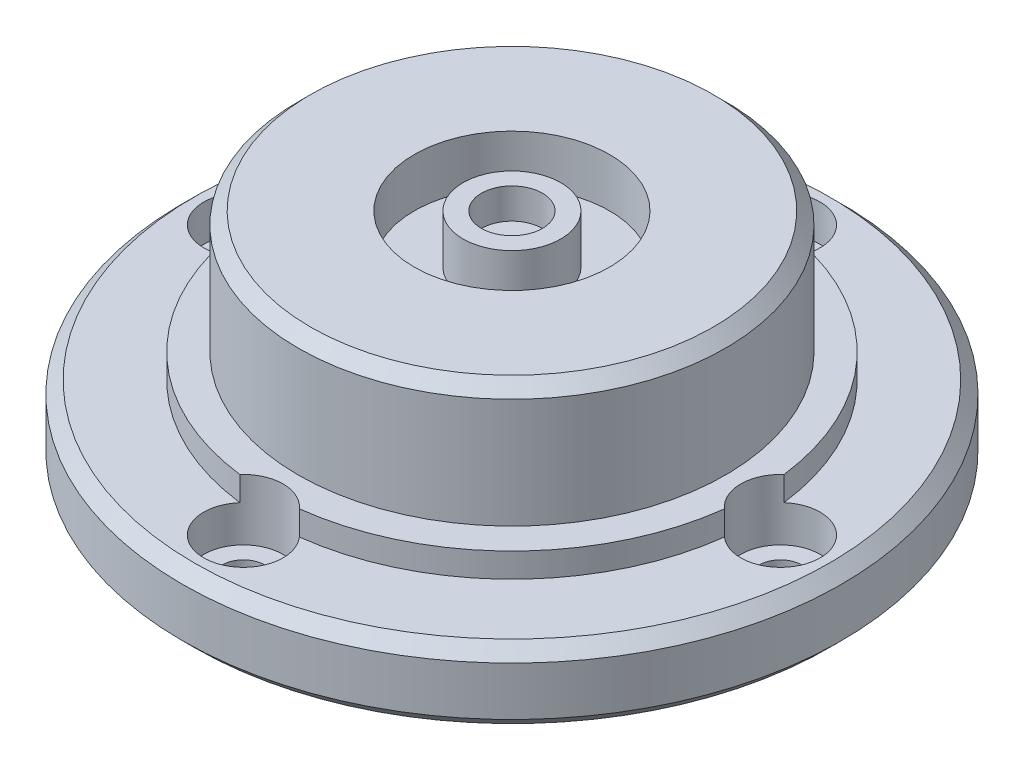
ISO-10303-21;
HEADER;
FILE_DESCRIPTION(('STEP AP214'),'2;1');
FILE_NAME('part.step','',(''),(''),'','','');
FILE_SCHEMA(('AUTOMOTIVE_DESIGN { 1 0 10303 214 1 1 1 1 }'));
ENDSEC;
DATA;
#1=APPLICATION_CONTEXT('core data for automotive mechanical design processes');
#2=APPLICATION_PROTOCOL_DEFINITION('international standard','automotive_design',2000,#1);
#3=PRODUCT_CONTEXT('',#1,'mechanical');
#4=PRODUCT('Part','Part','',(#3));
#5=PRODUCT_RELATED_PRODUCT_CATEGORY('part','',(#4));
#6=PRODUCT_DEFINITION_FORMATION('','',#4);
#7=PRODUCT_DEFINITION_CONTEXT('part definition',#1,'design');
#8=PRODUCT_DEFINITION('design','',#6,#7);
#9=PRODUCT_DEFINITION_SHAPE('','',#8);
#10=(LENGTH_UNIT() NAMED_UNIT(*) SI_UNIT(.MILLI.,.METRE.));
#11=(NAMED_UNIT(*) PLANE_ANGLE_UNIT() SI_UNIT($,.RADIAN.));
#12=(NAMED_UNIT(*) SI_UNIT($,.STERADIAN.) SOLID_ANGLE_UNIT());
#13=UNCERTAINTY_MEASURE_WITH_UNIT(LENGTH_MEASURE(1.E-05),#10,'distance_accuracy_value','');
#14=(GEOMETRIC_REPRESENTATION_CONTEXT(3) GLOBAL_UNCERTAINTY_ASSIGNED_CONTEXT((#13)) GLOBAL_UNIT_ASSIGNED_CONTEXT((#10,
#11,#12)) REPRESENTATION_CONTEXT('',''));
#15=CARTESIAN_POINT('',(0.,0.,0.));
#16=DIRECTION('',(0.,0.,1.));
#17=DIRECTION('',(1.,0.,0.));
#18=AXIS2_PLACEMENT_3D('',#15,#16,#17);
#19=CARTESIAN_POINT('',(0.,18.,0.));
#20=DIRECTION('',(0.,-1.,0.));
#21=DIRECTION('',(0.,0.,-1.));
#22=AXIS2_PLACEMENT_3D('',#19,#20,#21);
#23=CYLINDRICAL_SURFACE('',#22,20.);
#24=DIRECTION('',(0.,-1.,0.));
#25=VECTOR('',#24,1.);
#26=CARTESIAN_POINT('',(2.43796309372538,10.5,-19.8508522727271));
#27=LINE('',#26,#25);
#28=CARTESIAN_POINT('',(2.43796309372537,8.,-19.8508522727271));
#29=VERTEX_POINT('',#28);
#30=CARTESIAN_POINT('',(2.43796309372538,6.,-19.8508522727271));
#31=VERTEX_POINT('',#30);
#32=EDGE_CURVE('E234',#29,#31,#27,.T.);
#33=ORIENTED_EDGE('',*,*,#32,.F.);
#34=CARTESIAN_POINT('',(0.,8.,0.));
#35=DIRECTION('',(0.,1.,0.));
#36=DIRECTION('',(0.,0.,1.));
#37=AXIS2_PLACEMENT_3D('',#34,#35,#36);
#38=CIRCLE('',#37,20.);
#39=CARTESIAN_POINT('',(19.8508522727271,8.,-2.43796309372538));
#40=VERTEX_POINT('',#39);
#41=EDGE_CURVE('E120',#40,#29,#38,.T.);
#42=ORIENTED_EDGE('',*,*,#41,.F.);
#43=DIRECTION('',(0.,-1.,0.));
#44=VECTOR('',#43,1.);
#45=CARTESIAN_POINT('',(19.8508522727271,10.5,-2.43796309372538));
#46=LINE('',#45,#44);
#47=CARTESIAN_POINT('',(19.8508522727271,6.,-2.43796309372538));
#48=VERTEX_POINT('',#47);
#49=EDGE_CURVE('E227',#48,#40,#46,.F.);
#50=ORIENTED_EDGE('',*,*,#49,.F.);
#51=CARTESIAN_POINT('',(0.,6.,0.));
#52=DIRECTION('',(0.,1.,0.));
#53=DIRECTION('',(0.,0.,1.));
#54=AXIS2_PLACEMENT_3D('',#51,#52,#53);
#55=CIRCLE('',#54,20.);
#56=EDGE_CURVE('E252',#48,#31,#55,.T.);
#57=ORIENTED_EDGE('',*,*,#56,.T.);
#58=EDGE_LOOP('',(#33,#42,#50,#57));
#59=FACE_BOUND('',#58,.T.);
#60=ADVANCED_FACE('F33',(#59),#23,.T.);
#61=DIRECTION('',(0.,-1.,0.));
#62=VECTOR('',#61,1.);
#63=CARTESIAN_POINT('',(-2.43796309372538,10.5,-19.8508522727271));
#64=LINE('',#63,#62);
#65=CARTESIAN_POINT('',(-2.43796309372538,6.,-19.8508522727271));
#66=VERTEX_POINT('',#65);
#67=CARTESIAN_POINT('',(-2.43796309372537,8.,-19.8508522727271));
#68=VERTEX_POINT('',#67);
#69=EDGE_CURVE('E56',#66,#68,#64,.F.);
#70=ORIENTED_EDGE('',*,*,#69,.F.);
#71=CARTESIAN_POINT('',(-19.8508522727271,6.,-2.43796309372538));
#72=VERTEX_POINT('',#71);
#73=EDGE_CURVE('E114',#66,#72,#55,.T.);
#74=ORIENTED_EDGE('',*,*,#73,.T.);
#75=DIRECTION('',(0.,-1.,0.));
#76=VECTOR('',#75,1.);
#77=CARTESIAN_POINT('',(-19.8508522727271,10.5,-2.43796309372538));
#78=LINE('',#77,#76);
#79=CARTESIAN_POINT('',(-19.8508522727271,8.,-2.43796309372537));
#80=VERTEX_POINT('',#79);
#81=EDGE_CURVE('E99',#80,#72,#78,.T.);
#82=ORIENTED_EDGE('',*,*,#81,.F.);
#83=EDGE_CURVE('E112',#68,#80,#38,.T.);
#84=ORIENTED_EDGE('',*,*,#83,.F.);
#85=EDGE_LOOP('',(#70,#74,#82,#84));
#86=FACE_BOUND('',#85,.T.);
#87=ADVANCED_FACE('F111',(#86),#23,.T.);
#88=DIRECTION('',(0.,-1.,0.));
#89=VECTOR('',#88,1.);
#90=CARTESIAN_POINT('',(19.8508522727271,10.5,2.43796309372538));
#91=LINE('',#90,#89);
#92=CARTESIAN_POINT('',(19.8508522727271,8.,2.43796309372537));
#93=VERTEX_POINT('',#92);
#94=CARTESIAN_POINT('',(19.8508522727271,6.,2.43796309372538));
#95=VERTEX_POINT('',#94);
#96=EDGE_CURVE('E222',#93,#95,#91,.T.);
#97=ORIENTED_EDGE('',*,*,#96,.F.);
#98=CARTESIAN_POINT('',(2.43796309372538,8.,19.8508522727271));
#99=VERTEX_POINT('',#98);
#100=EDGE_CURVE('E123',#99,#93,#38,.T.);
#101=ORIENTED_EDGE('',*,*,#100,.F.);
#102=DIRECTION('',(0.,-1.,0.));
#103=VECTOR('',#102,1.);
#104=CARTESIAN_POINT('',(2.43796309372538,10.5,19.8508522727271));
#105=LINE('',#104,#103);
#106=CARTESIAN_POINT('',(2.43796309372538,6.,19.8508522727271));
#107=VERTEX_POINT('',#106);
#108=EDGE_CURVE('E215',#107,#99,#105,.F.);
#109=ORIENTED_EDGE('',*,*,#108,.F.);
#110=EDGE_CURVE('E223',#107,#95,#55,.T.);
#111=ORIENTED_EDGE('',*,*,#110,.T.);
#112=EDGE_LOOP('',(#97,#101,#109,#111));
#113=FACE_BOUND('',#112,.T.);
#114=ADVANCED_FACE('F193',(#113),#23,.T.);
#115=DIRECTION('',(0.,-1.,0.));
#116=VECTOR('',#115,1.);
#117=CARTESIAN_POINT('',(-2.43796309372538,10.5,19.8508522727271));
#118=LINE('',#117,#116);
#119=CARTESIAN_POINT('',(-2.43796309372537,8.,19.8508522727271));
#120=VERTEX_POINT('',#119);
#121=CARTESIAN_POINT('',(-2.43796309372538,6.,19.8508522727271));
#122=VERTEX_POINT('',#121);
#123=EDGE_CURVE('E210',#120,#122,#118,.T.);
#124=ORIENTED_EDGE('',*,*,#123,.F.);
#125=CARTESIAN_POINT('',(-19.8508522727271,8.,2.43796309372538));
#126=VERTEX_POINT('',#125);
#127=EDGE_CURVE('E121',#126,#120,#38,.T.);
#128=ORIENTED_EDGE('',*,*,#127,.F.);
#129=DIRECTION('',(0.,-1.,0.));
#130=VECTOR('',#129,1.);
#131=CARTESIAN_POINT('',(-19.8508522727271,10.5,2.43796309372538));
#132=LINE('',#131,#130);
#133=CARTESIAN_POINT('',(-19.8508522727271,6.,2.43796309372538));
#134=VERTEX_POINT('',#133);
#135=EDGE_CURVE('E48',#134,#126,#132,.F.);
#136=ORIENTED_EDGE('',*,*,#135,.F.);
#137=EDGE_CURVE('E128',#134,#122,#55,.T.);
#138=ORIENTED_EDGE('',*,*,#137,.T.);
#139=EDGE_LOOP('',(#124,#128,#136,#138));
#140=FACE_BOUND('',#139,.T.);
#141=ADVANCED_FACE('F189',(#140),#23,.T.);
#142=CARTESIAN_POINT('',(-22.,18.,0.));
#143=DIRECTION('',(0.,-1.,0.));
#144=DIRECTION('',(0.,0.,-1.));
#145=AXIS2_PLACEMENT_3D('',#142,#143,#144);
#146=CYLINDRICAL_SURFACE('',#145,1.75000000000146);
#147=CARTESIAN_POINT('',(-22.,0.,0.));
#148=DIRECTION('',(0.,1.,0.));
#149=DIRECTION('',(0.,0.,1.));
#150=AXIS2_PLACEMENT_3D('',#147,#148,#149);
#151=CIRCLE('',#150,1.75000000000146);
#152=CARTESIAN_POINT('',(-22.,0.,1.75000000000146));
#153=VERTEX_POINT('',#152);
#154=EDGE_CURVE('E239',#153,#153,#151,.T.);
#155=ORIENTED_EDGE('',*,*,#154,.F.);
#156=EDGE_LOOP('',(#155));
#157=FACE_BOUND('',#156,.T.);
#158=CARTESIAN_POINT('',(-22.,3.,0.));
#159=DIRECTION('',(0.,1.,0.));
#160=DIRECTION('',(0.,0.,1.));
#161=AXIS2_PLACEMENT_3D('',#158,#159,#160);
#162=CIRCLE('',#161,1.75000000000146);
#163=CARTESIAN_POINT('',(-22.,3.,1.75000000000146));
#164=VERTEX_POINT('',#163);
#165=EDGE_CURVE('E140',#164,#164,#162,.T.);
#166=ORIENTED_EDGE('',*,*,#165,.T.);
#167=EDGE_LOOP('',(#166));
#168=FACE_BOUND('',#167,.T.);
#169=ADVANCED_FACE('F198',(#157,#168),#146,.F.);
#170=CARTESIAN_POINT('',(0.,18.,22.));
#171=DIRECTION('',(0.,-1.,0.));
#172=DIRECTION('',(0.,0.,-1.));
#173=AXIS2_PLACEMENT_3D('',#170,#171,#172);
#174=CYLINDRICAL_SURFACE('',#173,1.75000000000146);
#175=CARTESIAN_POINT('',(0.,0.,22.));
#176=DIRECTION('',(0.,1.,0.));
#177=DIRECTION('',(0.,0.,1.));
#178=AXIS2_PLACEMENT_3D('',#175,#176,#177);
#179=CIRCLE('',#178,1.75000000000146);
#180=CARTESIAN_POINT('',(0.,0.,23.7500000000015));
#181=VERTEX_POINT('',#180);
#182=EDGE_CURVE('E246',#181,#181,#179,.T.);
#183=ORIENTED_EDGE('',*,*,#182,.F.);
#184=EDGE_LOOP('',(#183));
#185=FACE_BOUND('',#184,.T.);
#186=CARTESIAN_POINT('',(0.,3.,22.));
#187=DIRECTION('',(0.,1.,0.));
#188=DIRECTION('',(0.,0.,1.));
#189=AXIS2_PLACEMENT_3D('',#186,#187,#188);
#190=CIRCLE('',#189,1.75000000000146);
#191=CARTESIAN_POINT('',(0.,3.,23.7500000000015));
#192=VERTEX_POINT('',#191);
#193=EDGE_CURVE('E137',#192,#192,#190,.T.);
#194=ORIENTED_EDGE('',*,*,#193,.T.);
#195=EDGE_LOOP('',(#194));
#196=FACE_BOUND('',#195,.T.);
#197=ADVANCED_FACE('F204',(#185,#196),#174,.F.);
#198=CARTESIAN_POINT('',(22.,18.,0.));
#199=DIRECTION('',(0.,-1.,0.));
#200=DIRECTION('',(0.,0.,-1.));
#201=AXIS2_PLACEMENT_3D('',#198,#199,#200);
#202=CYLINDRICAL_SURFACE('',#201,1.75000000000146);
#203=CARTESIAN_POINT('',(22.,0.,0.));
#204=DIRECTION('',(0.,1.,0.));
#205=DIRECTION('',(0.,0.,1.));
#206=AXIS2_PLACEMENT_3D('',#203,#204,#205);
#207=CIRCLE('',#206,1.75000000000146);
#208=CARTESIAN_POINT('',(22.,0.,1.75000000000146));
#209=VERTEX_POINT('',#208);
#210=EDGE_CURVE('E243',#209,#209,#207,.T.);
#211=ORIENTED_EDGE('',*,*,#210,.F.);
#212=EDGE_LOOP('',(#211));
#213=FACE_BOUND('',#212,.T.);
#214=CARTESIAN_POINT('',(22.,3.,0.));
#215=DIRECTION('',(0.,1.,0.));
#216=DIRECTION('',(0.,0.,1.));
#217=AXIS2_PLACEMENT_3D('',#214,#215,#216);
#218=CIRCLE('',#217,1.75000000000146);
#219=CARTESIAN_POINT('',(22.,3.,1.75000000000146));
#220=VERTEX_POINT('',#219);
#221=EDGE_CURVE('E133',#220,#220,#218,.T.);
#222=ORIENTED_EDGE('',*,*,#221,.T.);
#223=EDGE_LOOP('',(#222));
#224=FACE_BOUND('',#223,.T.);
#225=ADVANCED_FACE('F313',(#213,#224),#202,.F.);
#226=CARTESIAN_POINT('',(0.,18.,-22.));
#227=DIRECTION('',(0.,-1.,0.));
#228=DIRECTION('',(0.,0.,-1.));
#229=AXIS2_PLACEMENT_3D('',#226,#227,#228);
#230=CYLINDRICAL_SURFACE('',#229,1.75000000000146);
#231=CARTESIAN_POINT('',(0.,0.,-22.));
#232=DIRECTION('',(0.,1.,0.));
#233=DIRECTION('',(0.,0.,1.));
#234=AXIS2_PLACEMENT_3D('',#231,#232,#233);
#235=CIRCLE('',#234,1.75000000000146);
#236=CARTESIAN_POINT('',(0.,0.,-20.2499999999985));
#237=VERTEX_POINT('',#236);
#238=EDGE_CURVE('E240',#237,#237,#235,.T.);
#239=ORIENTED_EDGE('',*,*,#238,.F.);
#240=EDGE_LOOP('',(#239));
#241=FACE_BOUND('',#240,.T.);
#242=CARTESIAN_POINT('',(0.,3.,-22.));
#243=DIRECTION('',(0.,1.,0.));
#244=DIRECTION('',(0.,0.,1.));
#245=AXIS2_PLACEMENT_3D('',#242,#243,#244);
#246=CIRCLE('',#245,1.75000000000146);
#247=CARTESIAN_POINT('',(0.,3.,-20.2499999999985));
#248=VERTEX_POINT('',#247);
#249=EDGE_CURVE('E130',#248,#248,#246,.T.);
#250=ORIENTED_EDGE('',*,*,#249,.T.);
#251=EDGE_LOOP('',(#250));
#252=FACE_BOUND('',#251,.T.);
#253=ADVANCED_FACE('F309',(#241,#252),#230,.F.);
#254=CARTESIAN_POINT('',(0.,18.,0.));
#255=DIRECTION('',(0.,-1.,0.));
#256=DIRECTION('',(0.,0.,-1.));
#257=AXIS2_PLACEMENT_3D('',#254,#255,#256);
#258=CYLINDRICAL_SURFACE('',#257,27.);
#259=CARTESIAN_POINT('',(0.,4.99999999999999,0.));
#260=DIRECTION('',(0.,1.,0.));
#261=DIRECTION('',(0.,0.,1.));
#262=AXIS2_PLACEMENT_3D('',#259,#260,#261);
#263=CIRCLE('',#262,27.);
#264=CARTESIAN_POINT('',(0.,4.99999999999999,27.));
#265=VERTEX_POINT('',#264);
#266=EDGE_CURVE('E11',#265,#265,#263,.F.);
#267=ORIENTED_EDGE('',*,*,#266,.T.);
#268=EDGE_LOOP('',(#267));
#269=FACE_BOUND('',#268,.T.);
#270=CARTESIAN_POINT('',(0.,0.999999999999997,0.));
#271=DIRECTION('',(0.,1.,0.));
#272=DIRECTION('',(0.,0.,1.));
#273=AXIS2_PLACEMENT_3D('',#270,#271,#272);
#274=CIRCLE('',#273,27.);
#275=CARTESIAN_POINT('',(0.,0.999999999999997,27.));
#276=VERTEX_POINT('',#275);
#277=EDGE_CURVE('E161',#276,#276,#274,.T.);
#278=ORIENTED_EDGE('',*,*,#277,.T.);
#279=EDGE_LOOP('',(#278));
#280=FACE_BOUND('',#279,.T.);
#281=ADVANCED_FACE('F312',(#269,#280),#258,.T.);
#282=CARTESIAN_POINT('',(0.,0.,0.));
#283=DIRECTION('',(0.,1.,0.));
#284=DIRECTION('',(0.,0.,1.));
#285=AXIS2_PLACEMENT_3D('',#282,#283,#284);
#286=PLANE('',#285);
#287=CARTESIAN_POINT('',(0.,0.,0.));
#288=DIRECTION('',(0.,1.,0.));
#289=DIRECTION('',(0.,0.,1.));
#290=AXIS2_PLACEMENT_3D('',#287,#288,#289);
#291=CIRCLE('',#290,26.);
#292=CARTESIAN_POINT('',(0.,0.,26.));
#293=VERTEX_POINT('',#292);
#294=EDGE_CURVE('E164',#293,#293,#291,.F.);
#295=ORIENTED_EDGE('',*,*,#294,.T.);
#296=EDGE_LOOP('',(#295));
#297=FACE_BOUND('',#296,.T.);
#298=CARTESIAN_POINT('',(0.,0.,0.));
#299=DIRECTION('',(0.,1.,0.));
#300=DIRECTION('',(0.,0.,1.));
#301=AXIS2_PLACEMENT_3D('',#298,#299,#300);
#302=CIRCLE('',#301,15.1);
#303=CARTESIAN_POINT('',(0.,0.,15.1));
#304=VERTEX_POINT('',#303);
#305=EDGE_CURVE('E149',#304,#304,#302,.T.);
#306=ORIENTED_EDGE('',*,*,#305,.T.);
#307=EDGE_LOOP('',(#306));
#308=FACE_BOUND('',#307,.T.);
#309=ORIENTED_EDGE('',*,*,#238,.T.);
#310=EDGE_LOOP('',(#309));
#311=FACE_BOUND('',#310,.T.);
#312=ORIENTED_EDGE('',*,*,#210,.T.);
#313=EDGE_LOOP('',(#312));
#314=FACE_BOUND('',#313,.T.);
#315=ORIENTED_EDGE('',*,*,#182,.T.);
#316=EDGE_LOOP('',(#315));
#317=FACE_BOUND('',#316,.T.);
#318=ORIENTED_EDGE('',*,*,#154,.T.);
#319=EDGE_LOOP('',(#318));
#320=FACE_BOUND('',#319,.T.);
#321=ADVANCED_FACE('F341',(#297,#308,#311,#314,#317,#320),#286,.F.);
#322=CARTESIAN_POINT('',(0.,5.,0.));
#323=DIRECTION('',(0.,-1.,0.));
#324=DIRECTION('',(0.,0.,-1.));
#325=AXIS2_PLACEMENT_3D('',#322,#323,#324);
#326=CYLINDRICAL_SURFACE('',#325,14.1);
#327=CARTESIAN_POINT('',(0.,0.999999999999994,0.));
#328=DIRECTION('',(0.,1.,0.));
#329=DIRECTION('',(0.,0.,1.));
#330=AXIS2_PLACEMENT_3D('',#327,#328,#329);
#331=CIRCLE('',#330,14.1);
#332=CARTESIAN_POINT('',(0.,0.999999999999994,14.1));
#333=VERTEX_POINT('',#332);
#334=EDGE_CURVE('E152',#333,#333,#331,.F.);
#335=ORIENTED_EDGE('',*,*,#334,.T.);
#336=EDGE_LOOP('',(#335));
#337=FACE_BOUND('',#336,.T.);
#338=CARTESIAN_POINT('',(0.,5.,0.));
#339=DIRECTION('',(0.,1.,0.));
#340=DIRECTION('',(0.,0.,1.));
#341=AXIS2_PLACEMENT_3D('',#338,#339,#340);
#342=CIRCLE('',#341,14.1);
#343=CARTESIAN_POINT('',(0.,5.,14.1));
#344=VERTEX_POINT('',#343);
#345=EDGE_CURVE('E106',#344,#344,#342,.T.);
#346=ORIENTED_EDGE('',*,*,#345,.T.);
#347=EDGE_LOOP('',(#346));
#348=FACE_BOUND('',#347,.T.);
#349=ADVANCED_FACE('F335',(#337,#348),#326,.F.);
#350=CARTESIAN_POINT('',(0.,5.,0.));
#351=DIRECTION('',(0.,1.,0.));
#352=DIRECTION('',(0.,0.,1.));
#353=AXIS2_PLACEMENT_3D('',#350,#351,#352);
#354=PLANE('',#353);
#355=ORIENTED_EDGE('',*,*,#345,.F.);
#356=EDGE_LOOP('',(#355));
#357=FACE_BOUND('',#356,.T.);
#358=ADVANCED_FACE('F329',(#357),#354,.F.);
#359=CARTESIAN_POINT('',(0.,6.,0.));
#360=DIRECTION('',(0.,1.,0.));
#361=DIRECTION('',(0.,0.,1.));
#362=AXIS2_PLACEMENT_3D('',#359,#360,#361);
#363=PLANE('',#362);
#364=CARTESIAN_POINT('',(0.,6.,0.));
#365=DIRECTION('',(0.,1.,0.));
#366=DIRECTION('',(0.,0.,1.));
#367=AXIS2_PLACEMENT_3D('',#364,#365,#366);
#368=CIRCLE('',#367,26.);
#369=CARTESIAN_POINT('',(0.,6.,26.));
#370=VERTEX_POINT('',#369);
#371=EDGE_CURVE('E41',#370,#370,#368,.T.);
#372=ORIENTED_EDGE('',*,*,#371,.T.);
#373=EDGE_LOOP('',(#372));
#374=FACE_BOUND('',#373,.T.);
#375=ORIENTED_EDGE('',*,*,#73,.F.);
#376=CARTESIAN_POINT('',(0.,6.,-22.));
#377=DIRECTION('',(0.,1.,0.));
#378=DIRECTION('',(0.,0.,1.));
#379=AXIS2_PLACEMENT_3D('',#376,#377,#378);
#380=CIRCLE('',#379,3.25000000000146);
#381=EDGE_CURVE('E236',#66,#31,#380,.F.);
#382=ORIENTED_EDGE('',*,*,#381,.T.);
#383=ORIENTED_EDGE('',*,*,#56,.F.);
#384=CARTESIAN_POINT('',(22.,6.,0.));
#385=DIRECTION('',(0.,1.,0.));
#386=DIRECTION('',(0.,0.,1.));
#387=AXIS2_PLACEMENT_3D('',#384,#385,#386);
#388=CIRCLE('',#387,3.25000000000146);
#389=EDGE_CURVE('E226',#48,#95,#388,.F.);
#390=ORIENTED_EDGE('',*,*,#389,.T.);
#391=ORIENTED_EDGE('',*,*,#110,.F.);
#392=CARTESIAN_POINT('',(0.,6.,22.));
#393=DIRECTION('',(0.,1.,0.));
#394=DIRECTION('',(0.,0.,1.));
#395=AXIS2_PLACEMENT_3D('',#392,#393,#394);
#396=CIRCLE('',#395,3.25000000000146);
#397=EDGE_CURVE('E214',#107,#122,#396,.F.);
#398=ORIENTED_EDGE('',*,*,#397,.T.);
#399=ORIENTED_EDGE('',*,*,#137,.F.);
#400=CARTESIAN_POINT('',(-22.,6.,0.));
#401=DIRECTION('',(0.,1.,0.));
#402=DIRECTION('',(0.,0.,1.));
#403=AXIS2_PLACEMENT_3D('',#400,#401,#402);
#404=CIRCLE('',#403,3.25000000000146);
#405=EDGE_CURVE('E115',#134,#72,#404,.F.);
#406=ORIENTED_EDGE('',*,*,#405,.T.);
#407=EDGE_LOOP('',(#375,#382,#383,#390,#391,#398,#399,#406));
#408=FACE_BOUND('',#407,.T.);
#409=ADVANCED_FACE('F169',(#374,#408),#363,.T.);
#410=CARTESIAN_POINT('',(0.,8.,0.));
#411=DIRECTION('',(0.,1.,0.));
#412=DIRECTION('',(0.,0.,1.));
#413=AXIS2_PLACEMENT_3D('',#410,#411,#412);
#414=PLANE('',#413);
#415=CARTESIAN_POINT('',(0.,8.,0.));
#416=DIRECTION('',(0.,1.,0.));
#417=DIRECTION('',(0.,0.,1.));
#418=AXIS2_PLACEMENT_3D('',#415,#416,#417);
#419=CIRCLE('',#418,17.5);
#420=CARTESIAN_POINT('',(0.,8.,17.5));
#421=VERTEX_POINT('',#420);
#422=EDGE_CURVE('E124',#421,#421,#419,.T.);
#423=ORIENTED_EDGE('',*,*,#422,.F.);
#424=EDGE_LOOP('',(#423));
#425=FACE_BOUND('',#424,.T.);
#426=ORIENTED_EDGE('',*,*,#41,.T.);
#427=CARTESIAN_POINT('',(0.,8.,-22.));
#428=DIRECTION('',(0.,1.,0.));
#429=DIRECTION('',(0.,0.,1.));
#430=AXIS2_PLACEMENT_3D('',#427,#428,#429);
#431=CIRCLE('',#430,3.25000000000146);
#432=EDGE_CURVE('E119',#29,#68,#431,.F.);
#433=ORIENTED_EDGE('',*,*,#432,.T.);
#434=ORIENTED_EDGE('',*,*,#83,.T.);
#435=CARTESIAN_POINT('',(-22.,8.,0.));
#436=DIRECTION('',(0.,1.,0.));
#437=DIRECTION('',(0.,0.,1.));
#438=AXIS2_PLACEMENT_3D('',#435,#436,#437);
#439=CIRCLE('',#438,3.25000000000146);
#440=EDGE_CURVE('E95',#80,#126,#439,.F.);
#441=ORIENTED_EDGE('',*,*,#440,.T.);
#442=ORIENTED_EDGE('',*,*,#127,.T.);
#443=CARTESIAN_POINT('',(0.,8.,22.));
#444=DIRECTION('',(0.,1.,0.));
#445=DIRECTION('',(0.,0.,1.));
#446=AXIS2_PLACEMENT_3D('',#443,#444,#445);
#447=CIRCLE('',#446,3.25000000000146);
#448=EDGE_CURVE('E105',#120,#99,#447,.F.);
#449=ORIENTED_EDGE('',*,*,#448,.T.);
#450=ORIENTED_EDGE('',*,*,#100,.T.);
#451=CARTESIAN_POINT('',(22.,8.,0.));
#452=DIRECTION('',(0.,1.,0.));
#453=DIRECTION('',(0.,0.,1.));
#454=AXIS2_PLACEMENT_3D('',#451,#452,#453);
#455=CIRCLE('',#454,3.25000000000146);
#456=EDGE_CURVE('E145',#93,#40,#455,.F.);
#457=ORIENTED_EDGE('',*,*,#456,.T.);
#458=EDGE_LOOP('',(#426,#433,#434,#441,#442,#449,#450,#457));
#459=FACE_BOUND('',#458,.T.);
#460=ADVANCED_FACE('F118',(#425,#459),#414,.T.);
#461=CARTESIAN_POINT('',(0.,18.,0.));
#462=DIRECTION('',(0.,-1.,0.));
#463=DIRECTION('',(0.,0.,-1.));
#464=AXIS2_PLACEMENT_3D('',#461,#462,#463);
#465=CYLINDRICAL_SURFACE('',#464,17.5);
#466=CARTESIAN_POINT('',(0.,17.,0.));
#467=DIRECTION('',(0.,1.,0.));
#468=DIRECTION('',(0.,0.,1.));
#469=AXIS2_PLACEMENT_3D('',#466,#467,#468);
#470=CIRCLE('',#469,17.5);
#471=CARTESIAN_POINT('',(0.,17.,17.5));
#472=VERTEX_POINT('',#471);
#473=EDGE_CURVE('E158',#472,#472,#470,.F.);
#474=ORIENTED_EDGE('',*,*,#473,.T.);
#475=EDGE_LOOP('',(#474));
#476=FACE_BOUND('',#475,.T.);
#477=ORIENTED_EDGE('',*,*,#422,.T.);
#478=EDGE_LOOP('',(#477));
#479=FACE_BOUND('',#478,.T.);
#480=ADVANCED_FACE('F321',(#476,#479),#465,.T.);
#481=CARTESIAN_POINT('',(0.,18.,0.));
#482=DIRECTION('',(0.,1.,0.));
#483=DIRECTION('',(0.,0.,1.));
#484=AXIS2_PLACEMENT_3D('',#481,#482,#483);
#485=PLANE('',#484);
#486=CARTESIAN_POINT('',(0.,18.,0.));
#487=DIRECTION('',(0.,1.,0.));
#488=DIRECTION('',(0.,0.,1.));
#489=AXIS2_PLACEMENT_3D('',#486,#487,#488);
#490=CIRCLE('',#489,8.);
#491=CARTESIAN_POINT('',(0.,18.,8.));
#492=VERTEX_POINT('',#491);
#493=EDGE_CURVE('E463',#492,#492,#490,.T.);
#494=ORIENTED_EDGE('',*,*,#493,.F.);
#495=EDGE_LOOP('',(#494));
#496=FACE_BOUND('',#495,.T.);
#497=CARTESIAN_POINT('',(0.,18.,0.));
#498=DIRECTION('',(0.,1.,0.));
#499=DIRECTION('',(0.,0.,1.));
#500=AXIS2_PLACEMENT_3D('',#497,#498,#499);
#501=CIRCLE('',#500,16.5);
#502=CARTESIAN_POINT('',(0.,18.,16.5));
#503=VERTEX_POINT('',#502);
#504=EDGE_CURVE('E155',#503,#503,#501,.T.);
#505=ORIENTED_EDGE('',*,*,#504,.T.);
#506=EDGE_LOOP('',(#505));
#507=FACE_BOUND('',#506,.T.);
#508=ADVANCED_FACE('F262',(#496,#507),#485,.T.);
#509=CARTESIAN_POINT('',(0.,18.,-22.));
#510=DIRECTION('',(0.,-1.,0.));
#511=DIRECTION('',(0.,0.,-1.));
#512=AXIS2_PLACEMENT_3D('',#509,#510,#511);
#513=CYLINDRICAL_SURFACE('',#512,3.25000000000146);
#514=ORIENTED_EDGE('',*,*,#69,.T.);
#515=ORIENTED_EDGE('',*,*,#432,.F.);
#516=ORIENTED_EDGE('',*,*,#32,.T.);
#517=ORIENTED_EDGE('',*,*,#381,.F.);
#518=EDGE_LOOP('',(#514,#515,#516,#517));
#519=FACE_BOUND('',#518,.T.);
#520=CARTESIAN_POINT('',(0.,3.,-22.));
#521=DIRECTION('',(0.,1.,0.));
#522=DIRECTION('',(0.,0.,1.));
#523=AXIS2_PLACEMENT_3D('',#520,#521,#522);
#524=CIRCLE('',#523,3.25000000000146);
#525=CARTESIAN_POINT('',(0.,3.,-18.7499999999985));
#526=VERTEX_POINT('',#525);
#527=EDGE_CURVE('E134',#526,#526,#524,.T.);
#528=ORIENTED_EDGE('',*,*,#527,.F.);
#529=EDGE_LOOP('',(#528));
#530=FACE_BOUND('',#529,.T.);
#531=ADVANCED_FACE('F258',(#519,#530),#513,.F.);
#532=CARTESIAN_POINT('',(0.,3.,-22.));
#533=DIRECTION('',(0.,1.,0.));
#534=DIRECTION('',(0.,0.,1.));
#535=AXIS2_PLACEMENT_3D('',#532,#533,#534);
#536=PLANE('',#535);
#537=ORIENTED_EDGE('',*,*,#249,.F.);
#538=EDGE_LOOP('',(#537));
#539=FACE_BOUND('',#538,.T.);
#540=ORIENTED_EDGE('',*,*,#527,.T.);
#541=EDGE_LOOP('',(#540));
#542=FACE_BOUND('',#541,.T.);
#543=ADVANCED_FACE('F261',(#539,#542),#536,.T.);
#544=CARTESIAN_POINT('',(22.,18.,0.));
#545=DIRECTION('',(0.,-1.,0.));
#546=DIRECTION('',(0.,0.,-1.));
#547=AXIS2_PLACEMENT_3D('',#544,#545,#546);
#548=CYLINDRICAL_SURFACE('',#547,3.25000000000146);
#549=ORIENTED_EDGE('',*,*,#49,.T.);
#550=ORIENTED_EDGE('',*,*,#456,.F.);
#551=ORIENTED_EDGE('',*,*,#96,.T.);
#552=ORIENTED_EDGE('',*,*,#389,.F.);
#553=EDGE_LOOP('',(#549,#550,#551,#552));
#554=FACE_BOUND('',#553,.T.);
#555=CARTESIAN_POINT('',(22.,3.,0.));
#556=DIRECTION('',(0.,1.,0.));
#557=DIRECTION('',(0.,0.,1.));
#558=AXIS2_PLACEMENT_3D('',#555,#556,#557);
#559=CIRCLE('',#558,3.25000000000146);
#560=CARTESIAN_POINT('',(22.,3.,3.25000000000146));
#561=VERTEX_POINT('',#560);
#562=EDGE_CURVE('E267',#561,#561,#559,.T.);
#563=ORIENTED_EDGE('',*,*,#562,.F.);
#564=EDGE_LOOP('',(#563));
#565=FACE_BOUND('',#564,.T.);
#566=ADVANCED_FACE('F302',(#554,#565),#548,.F.);
#567=CARTESIAN_POINT('',(22.,3.,0.));
#568=DIRECTION('',(0.,1.,0.));
#569=DIRECTION('',(0.,0.,1.));
#570=AXIS2_PLACEMENT_3D('',#567,#568,#569);
#571=PLANE('',#570);
#572=ORIENTED_EDGE('',*,*,#221,.F.);
#573=EDGE_LOOP('',(#572));
#574=FACE_BOUND('',#573,.T.);
#575=ORIENTED_EDGE('',*,*,#562,.T.);
#576=EDGE_LOOP('',(#575));
#577=FACE_BOUND('',#576,.T.);
#578=ADVANCED_FACE('F288',(#574,#577),#571,.T.);
#579=CARTESIAN_POINT('',(0.,18.,22.));
#580=DIRECTION('',(0.,-1.,0.));
#581=DIRECTION('',(0.,0.,-1.));
#582=AXIS2_PLACEMENT_3D('',#579,#580,#581);
#583=CYLINDRICAL_SURFACE('',#582,3.25000000000146);
#584=ORIENTED_EDGE('',*,*,#108,.T.);
#585=ORIENTED_EDGE('',*,*,#448,.F.);
#586=ORIENTED_EDGE('',*,*,#123,.T.);
#587=ORIENTED_EDGE('',*,*,#397,.F.);
#588=EDGE_LOOP('',(#584,#585,#586,#587));
#589=FACE_BOUND('',#588,.T.);
#590=CARTESIAN_POINT('',(0.,3.,22.));
#591=DIRECTION('',(0.,1.,0.));
#592=DIRECTION('',(0.,0.,1.));
#593=AXIS2_PLACEMENT_3D('',#590,#591,#592);
#594=CIRCLE('',#593,3.25000000000146);
#595=CARTESIAN_POINT('',(0.,3.,25.2500000000015));
#596=VERTEX_POINT('',#595);
#597=EDGE_CURVE('E270',#596,#596,#594,.T.);
#598=ORIENTED_EDGE('',*,*,#597,.F.);
#599=EDGE_LOOP('',(#598));
#600=FACE_BOUND('',#599,.T.);
#601=ADVANCED_FACE('F284',(#589,#600),#583,.F.);
#602=CARTESIAN_POINT('',(0.,3.,22.));
#603=DIRECTION('',(0.,1.,0.));
#604=DIRECTION('',(0.,0.,1.));
#605=AXIS2_PLACEMENT_3D('',#602,#603,#604);
#606=PLANE('',#605);
#607=ORIENTED_EDGE('',*,*,#193,.F.);
#608=EDGE_LOOP('',(#607));
#609=FACE_BOUND('',#608,.T.);
#610=ORIENTED_EDGE('',*,*,#597,.T.);
#611=EDGE_LOOP('',(#610));
#612=FACE_BOUND('',#611,.T.);
#613=ADVANCED_FACE('F287',(#609,#612),#606,.T.);
#614=CARTESIAN_POINT('',(-22.,18.,0.));
#615=DIRECTION('',(0.,-1.,0.));
#616=DIRECTION('',(0.,0.,-1.));
#617=AXIS2_PLACEMENT_3D('',#614,#615,#616);
#618=CYLINDRICAL_SURFACE('',#617,3.25000000000146);
#619=ORIENTED_EDGE('',*,*,#135,.T.);
#620=ORIENTED_EDGE('',*,*,#440,.F.);
#621=ORIENTED_EDGE('',*,*,#81,.T.);
#622=ORIENTED_EDGE('',*,*,#405,.F.);
#623=EDGE_LOOP('',(#619,#620,#621,#622));
#624=FACE_BOUND('',#623,.T.);
#625=CARTESIAN_POINT('',(-22.,3.,0.));
#626=DIRECTION('',(0.,1.,0.));
#627=DIRECTION('',(0.,0.,1.));
#628=AXIS2_PLACEMENT_3D('',#625,#626,#627);
#629=CIRCLE('',#628,3.25000000000146);
#630=CARTESIAN_POINT('',(-22.,3.,3.25000000000146));
#631=VERTEX_POINT('',#630);
#632=EDGE_CURVE('E278',#631,#631,#629,.T.);
#633=ORIENTED_EDGE('',*,*,#632,.F.);
#634=EDGE_LOOP('',(#633));
#635=FACE_BOUND('',#634,.T.);
#636=ADVANCED_FACE('F97',(#624,#635),#618,.F.);
#637=CARTESIAN_POINT('',(-22.,3.,0.));
#638=DIRECTION('',(0.,1.,0.));
#639=DIRECTION('',(0.,0.,1.));
#640=AXIS2_PLACEMENT_3D('',#637,#638,#639);
#641=PLANE('',#640);
#642=ORIENTED_EDGE('',*,*,#165,.F.);
#643=EDGE_LOOP('',(#642));
#644=FACE_BOUND('',#643,.T.);
#645=ORIENTED_EDGE('',*,*,#632,.T.);
#646=EDGE_LOOP('',(#645));
#647=FACE_BOUND('',#646,.T.);
#648=ADVANCED_FACE('F298',(#644,#647),#641,.T.);
#649=CARTESIAN_POINT('',(0.,0.,0.));
#650=DIRECTION('',(0.,-1.,0.));
#651=DIRECTION('',(0.,0.,-1.));
#652=AXIS2_PLACEMENT_3D('',#649,#650,#651);
#653=CONICAL_SURFACE('',#652,15.1,0.785398163397445);
#654=ORIENTED_EDGE('',*,*,#334,.F.);
#655=EDGE_LOOP('',(#654));
#656=FACE_BOUND('',#655,.T.);
#657=ORIENTED_EDGE('',*,*,#305,.F.);
#658=EDGE_LOOP('',(#657));
#659=FACE_BOUND('',#658,.T.);
#660=ADVANCED_FACE('F306',(#656,#659),#653,.F.);
#661=CARTESIAN_POINT('',(0.,18.,0.));
#662=DIRECTION('',(0.,-1.,0.));
#663=DIRECTION('',(0.,0.,-1.));
#664=AXIS2_PLACEMENT_3D('',#661,#662,#663);
#665=CONICAL_SURFACE('',#664,16.5,0.785398163397447);
#666=ORIENTED_EDGE('',*,*,#473,.F.);
#667=EDGE_LOOP('',(#666));
#668=FACE_BOUND('',#667,.T.);
#669=ORIENTED_EDGE('',*,*,#504,.F.);
#670=EDGE_LOOP('',(#669));
#671=FACE_BOUND('',#670,.T.);
#672=ADVANCED_FACE('F183',(#668,#671),#665,.T.);
#673=CARTESIAN_POINT('',(0.,0.999999999999997,0.));
#674=DIRECTION('',(0.,1.,0.));
#675=DIRECTION('',(0.,0.,1.));
#676=AXIS2_PLACEMENT_3D('',#673,#674,#675);
#677=CONICAL_SURFACE('',#676,27.,0.785398163397452);
#678=ORIENTED_EDGE('',*,*,#294,.F.);
#679=EDGE_LOOP('',(#678));
#680=FACE_BOUND('',#679,.T.);
#681=ORIENTED_EDGE('',*,*,#277,.F.);
#682=EDGE_LOOP('',(#681));
#683=FACE_BOUND('',#682,.T.);
#684=ADVANCED_FACE('F174',(#680,#683),#677,.T.);
#685=CARTESIAN_POINT('',(0.,6.,0.));
#686=DIRECTION('',(0.,-1.,0.));
#687=DIRECTION('',(0.,0.,-1.));
#688=AXIS2_PLACEMENT_3D('',#685,#686,#687);
#689=CONICAL_SURFACE('',#688,26.,0.785398163397443);
#690=ORIENTED_EDGE('',*,*,#266,.F.);
#691=EDGE_LOOP('',(#690));
#692=FACE_BOUND('',#691,.T.);
#693=ORIENTED_EDGE('',*,*,#371,.F.);
#694=EDGE_LOOP('',(#693));
#695=FACE_BOUND('',#694,.T.);
#696=ADVANCED_FACE('F35',(#692,#695),#689,.T.);
#697=CARTESIAN_POINT('',(0.,14.,0.));
#698=DIRECTION('',(0.,1.,0.));
#699=DIRECTION('',(0.,0.,1.));
#700=AXIS2_PLACEMENT_3D('',#697,#698,#699);
#701=CYLINDRICAL_SURFACE('',#700,8.);
#702=CARTESIAN_POINT('',(0.,14.,0.));
#703=DIRECTION('',(0.,1.,0.));
#704=DIRECTION('',(0.,0.,1.));
#705=AXIS2_PLACEMENT_3D('',#702,#703,#704);
#706=CIRCLE('',#705,8.);
#707=CARTESIAN_POINT('',(0.,14.,8.));
#708=VERTEX_POINT('',#707);
#709=EDGE_CURVE('E466',#708,#708,#706,.T.);
#710=ORIENTED_EDGE('',*,*,#709,.F.);
#711=EDGE_LOOP('',(#710));
#712=FACE_BOUND('',#711,.T.);
#713=ORIENTED_EDGE('',*,*,#493,.T.);
#714=EDGE_LOOP('',(#713));
#715=FACE_BOUND('',#714,.T.);
#716=ADVANCED_FACE('F173',(#712,#715),#701,.F.);
#717=CARTESIAN_POINT('',(0.,14.,0.));
#718=DIRECTION('',(0.,1.,0.));
#719=DIRECTION('',(0.,0.,1.));
#720=AXIS2_PLACEMENT_3D('',#717,#718,#719);
#721=PLANE('',#720);
#722=CARTESIAN_POINT('',(0.,14.,0.));
#723=DIRECTION('',(0.,1.,0.));
#724=DIRECTION('',(0.,0.,1.));
#725=AXIS2_PLACEMENT_3D('',#722,#723,#724);
#726=CIRCLE('',#725,4.);
#727=CARTESIAN_POINT('',(0.,14.,4.));
#728=VERTEX_POINT('',#727);
#729=EDGE_CURVE('E460',#728,#728,#726,.T.);
#730=ORIENTED_EDGE('',*,*,#729,.F.);
#731=EDGE_LOOP('',(#730));
#732=FACE_BOUND('',#731,.T.);
#733=ORIENTED_EDGE('',*,*,#709,.T.);
#734=EDGE_LOOP('',(#733));
#735=FACE_BOUND('',#734,.T.);
#736=ADVANCED_FACE('F180',(#732,#735),#721,.T.);
#737=CARTESIAN_POINT('',(0.,14.,0.));
#738=DIRECTION('',(0.,1.,0.));
#739=DIRECTION('',(0.,0.,1.));
#740=AXIS2_PLACEMENT_3D('',#737,#738,#739);
#741=CYLINDRICAL_SURFACE('',#740,4.);
#742=ORIENTED_EDGE('',*,*,#729,.T.);
#743=EDGE_LOOP('',(#742));
#744=FACE_BOUND('',#743,.T.);
#745=CARTESIAN_POINT('',(0.,18.,0.));
#746=DIRECTION('',(0.,1.,0.));
#747=DIRECTION('',(0.,0.,1.));
#748=AXIS2_PLACEMENT_3D('',#745,#746,#747);
#749=CIRCLE('',#748,4.);
#750=CARTESIAN_POINT('',(0.,18.,4.));
#751=VERTEX_POINT('',#750);
#752=EDGE_CURVE('E458',#751,#751,#749,.T.);
#753=ORIENTED_EDGE('',*,*,#752,.F.);
#754=EDGE_LOOP('',(#753));
#755=FACE_BOUND('',#754,.T.);
#756=ADVANCED_FACE('F411',(#744,#755),#741,.T.);
#757=CARTESIAN_POINT('',(0.,15.5,0.));
#758=DIRECTION('',(0.,1.,0.));
#759=DIRECTION('',(0.,0.,1.));
#760=AXIS2_PLACEMENT_3D('',#757,#758,#759);
#761=PLANE('',#760);
#762=CARTESIAN_POINT('',(0.,15.5,0.));
#763=DIRECTION('',(0.,1.,0.));
#764=DIRECTION('',(0.,0.,1.));
#765=AXIS2_PLACEMENT_3D('',#762,#763,#764);
#766=CIRCLE('',#765,2.5);
#767=CARTESIAN_POINT('',(0.,15.5,2.5));
#768=VERTEX_POINT('',#767);
#769=EDGE_CURVE('E281',#768,#768,#766,.T.);
#770=ORIENTED_EDGE('',*,*,#769,.T.);
#771=EDGE_LOOP('',(#770));
#772=FACE_BOUND('',#771,.T.);
#773=ADVANCED_FACE('F400',(#772),#761,.T.);
#774=CARTESIAN_POINT('',(0.,15.5,0.));
#775=DIRECTION('',(0.,1.,0.));
#776=DIRECTION('',(0.,0.,1.));
#777=AXIS2_PLACEMENT_3D('',#774,#775,#776);
#778=CYLINDRICAL_SURFACE('',#777,2.5);
#779=ORIENTED_EDGE('',*,*,#769,.F.);
#780=EDGE_LOOP('',(#779));
#781=FACE_BOUND('',#780,.T.);
#782=CARTESIAN_POINT('',(0.,18.,0.));
#783=DIRECTION('',(0.,1.,0.));
#784=DIRECTION('',(0.,0.,1.));
#785=AXIS2_PLACEMENT_3D('',#782,#783,#784);
#786=CIRCLE('',#785,2.5);
#787=CARTESIAN_POINT('',(0.,18.,2.5));
#788=VERTEX_POINT('',#787);
#789=EDGE_CURVE('E273',#788,#788,#786,.T.);
#790=ORIENTED_EDGE('',*,*,#789,.T.);
#791=EDGE_LOOP('',(#790));
#792=FACE_BOUND('',#791,.T.);
#793=ADVANCED_FACE('F396',(#781,#792),#778,.F.);
#794=ORIENTED_EDGE('',*,*,#789,.F.);
#795=EDGE_LOOP('',(#794));
#796=FACE_BOUND('',#795,.T.);
#797=ORIENTED_EDGE('',*,*,#752,.T.);
#798=EDGE_LOOP('',(#797));
#799=FACE_BOUND('',#798,.T.);
#800=ADVANCED_FACE('F346',(#796,#799),#485,.T.);
#801=CLOSED_SHELL('',(#60,#87,#114,#141,#169,#197,#225,#253,#281,#321,#349,#358,#409,#460,#480,
#508,#531,#543,#566,#578,#601,#613,#636,#648,#660,#672,#684,#696,#716,#736,#756,#773,#793,#800));
#802=MANIFOLD_SOLID_BREP('B2',#801);
#803=ADVANCED_BREP_SHAPE_REPRESENTATION('',(#18,#802),#14);
#804=SHAPE_DEFINITION_REPRESENTATION(#9,#803);
ENDSEC;
END-ISO-10303-21;
